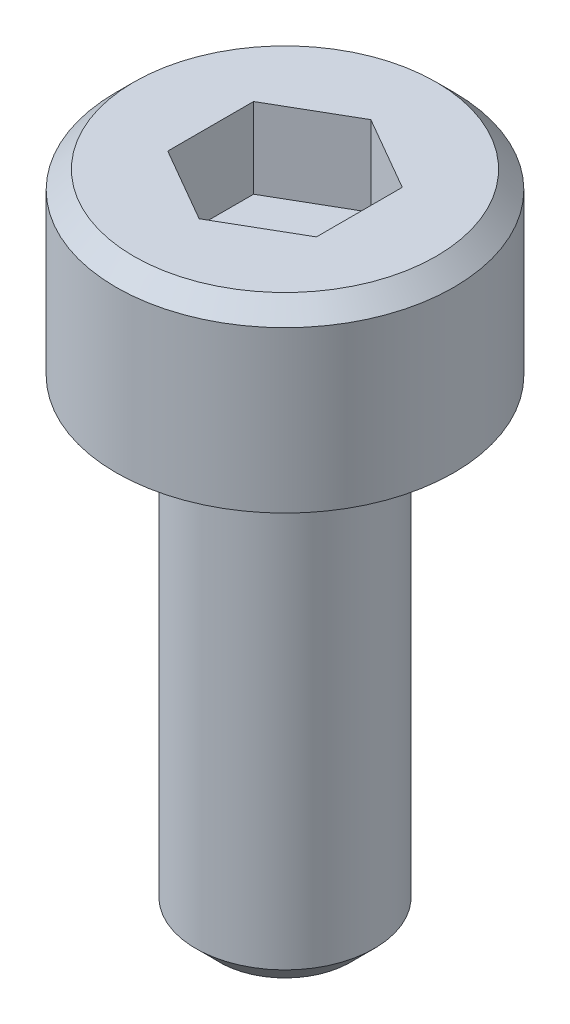
ISO-10303-21;
HEADER;
FILE_DESCRIPTION(('STEP AP214'),'2;1');
FILE_NAME('part.step','',(''),(''),'','','');
FILE_SCHEMA(('AUTOMOTIVE_DESIGN { 1 0 10303 214 1 1 1 1 }'));
ENDSEC;
DATA;
#1=APPLICATION_CONTEXT('core data for automotive mechanical design processes');
#2=APPLICATION_PROTOCOL_DEFINITION('international standard','automotive_design',2000,#1);
#3=PRODUCT_CONTEXT('',#1,'mechanical');
#4=PRODUCT('Part','Part','',(#3));
#5=PRODUCT_RELATED_PRODUCT_CATEGORY('part','',(#4));
#6=PRODUCT_DEFINITION_FORMATION('','',#4);
#7=PRODUCT_DEFINITION_CONTEXT('part definition',#1,'design');
#8=PRODUCT_DEFINITION('design','',#6,#7);
#9=PRODUCT_DEFINITION_SHAPE('','',#8);
#10=(LENGTH_UNIT() NAMED_UNIT(*) SI_UNIT(.MILLI.,.METRE.));
#11=(NAMED_UNIT(*) PLANE_ANGLE_UNIT() SI_UNIT($,.RADIAN.));
#12=(NAMED_UNIT(*) SI_UNIT($,.STERADIAN.) SOLID_ANGLE_UNIT());
#13=UNCERTAINTY_MEASURE_WITH_UNIT(LENGTH_MEASURE(1.E-05),#10,'distance_accuracy_value','');
#14=(GEOMETRIC_REPRESENTATION_CONTEXT(3) GLOBAL_UNCERTAINTY_ASSIGNED_CONTEXT((#13)) GLOBAL_UNIT_ASSIGNED_CONTEXT((#10,
#11,#12)) REPRESENTATION_CONTEXT('',''));
#15=CARTESIAN_POINT('',(0.,0.,0.));
#16=DIRECTION('',(0.,0.,1.));
#17=DIRECTION('',(1.,0.,0.));
#18=AXIS2_PLACEMENT_3D('',#15,#16,#17);
#19=CARTESIAN_POINT('',(0.,-8.,0.));
#20=DIRECTION('',(0.,-1.,0.));
#21=DIRECTION('',(0.,0.,-1.));
#22=AXIS2_PLACEMENT_3D('',#19,#20,#21);
#23=PLANE('',#22);
#24=CARTESIAN_POINT('',(0.,-8.,0.));
#25=DIRECTION('',(0.,-1.,0.));
#26=DIRECTION('',(0.,0.,-1.));
#27=AXIS2_PLACEMENT_3D('',#24,#25,#26);
#28=CIRCLE('',#27,1.1);
#29=CARTESIAN_POINT('',(0.,-8.,-1.1));
#30=VERTEX_POINT('',#29);
#31=EDGE_CURVE('E11',#30,#30,#28,.T.);
#32=ORIENTED_EDGE('',*,*,#31,.T.);
#33=EDGE_LOOP('',(#32));
#34=FACE_BOUND('',#33,.T.);
#35=ADVANCED_FACE('F41',(#34),#23,.T.);
#36=CARTESIAN_POINT('',(0.,-8.,0.));
#37=DIRECTION('',(0.,1.,0.));
#38=DIRECTION('',(0.,0.,1.));
#39=AXIS2_PLACEMENT_3D('',#36,#37,#38);
#40=CONICAL_SURFACE('',#39,1.1,0.785398163397448);
#41=CARTESIAN_POINT('',(0.,-7.6,0.));
#42=DIRECTION('',(0.,-1.,0.));
#43=DIRECTION('',(0.,0.,-1.));
#44=AXIS2_PLACEMENT_3D('',#41,#42,#43);
#45=CIRCLE('',#44,1.5);
#46=CARTESIAN_POINT('',(0.,-7.6,-1.5));
#47=VERTEX_POINT('',#46);
#48=EDGE_CURVE('E48',#47,#47,#45,.T.);
#49=ORIENTED_EDGE('',*,*,#48,.T.);
#50=EDGE_LOOP('',(#49));
#51=FACE_BOUND('',#50,.T.);
#52=ORIENTED_EDGE('',*,*,#31,.F.);
#53=EDGE_LOOP('',(#52));
#54=FACE_BOUND('',#53,.T.);
#55=ADVANCED_FACE('F161',(#51,#54),#40,.T.);
#56=CARTESIAN_POINT('',(0.,-10.,0.));
#57=DIRECTION('',(0.,-1.,0.));
#58=DIRECTION('',(0.,0.,-1.));
#59=AXIS2_PLACEMENT_3D('',#56,#57,#58);
#60=CYLINDRICAL_SURFACE('',#59,1.5);
#61=CARTESIAN_POINT('',(0.,0.,0.));
#62=DIRECTION('',(0.,-1.,0.));
#63=DIRECTION('',(0.,0.,-1.));
#64=AXIS2_PLACEMENT_3D('',#61,#62,#63);
#65=CIRCLE('',#64,1.5);
#66=CARTESIAN_POINT('',(0.,0.,-1.5));
#67=VERTEX_POINT('',#66);
#68=EDGE_CURVE('E156',#67,#67,#65,.T.);
#69=ORIENTED_EDGE('',*,*,#68,.T.);
#70=EDGE_LOOP('',(#69));
#71=FACE_BOUND('',#70,.T.);
#72=ORIENTED_EDGE('',*,*,#48,.F.);
#73=EDGE_LOOP('',(#72));
#74=FACE_BOUND('',#73,.T.);
#75=ADVANCED_FACE('F164',(#71,#74),#60,.T.);
#76=CARTESIAN_POINT('',(1.5,0.,0.));
#77=DIRECTION('',(0.,-1.,0.));
#78=DIRECTION('',(0.,0.,-1.));
#79=AXIS2_PLACEMENT_3D('',#76,#77,#78);
#80=PLANE('',#79);
#81=CARTESIAN_POINT('',(0.,0.,0.));
#82=DIRECTION('',(0.,-1.,0.));
#83=DIRECTION('',(0.,0.,-1.));
#84=AXIS2_PLACEMENT_3D('',#81,#82,#83);
#85=CIRCLE('',#84,2.84);
#86=CARTESIAN_POINT('',(0.,0.,-2.84));
#87=VERTEX_POINT('',#86);
#88=EDGE_CURVE('E153',#87,#87,#85,.T.);
#89=ORIENTED_EDGE('',*,*,#88,.T.);
#90=EDGE_LOOP('',(#89));
#91=FACE_BOUND('',#90,.T.);
#92=ORIENTED_EDGE('',*,*,#68,.F.);
#93=EDGE_LOOP('',(#92));
#94=FACE_BOUND('',#93,.T.);
#95=ADVANCED_FACE('F166',(#91,#94),#80,.T.);
#96=CARTESIAN_POINT('',(0.,-10.,0.));
#97=DIRECTION('',(0.,-1.,0.));
#98=DIRECTION('',(0.,0.,-1.));
#99=AXIS2_PLACEMENT_3D('',#96,#97,#98);
#100=CYLINDRICAL_SURFACE('',#99,2.84);
#101=CARTESIAN_POINT('',(0.,2.7,0.));
#102=DIRECTION('',(0.,-1.,0.));
#103=DIRECTION('',(0.,0.,-1.));
#104=AXIS2_PLACEMENT_3D('',#101,#102,#103);
#105=CIRCLE('',#104,2.84);
#106=CARTESIAN_POINT('',(0.,2.7,-2.84));
#107=VERTEX_POINT('',#106);
#108=EDGE_CURVE('E150',#107,#107,#105,.T.);
#109=ORIENTED_EDGE('',*,*,#108,.T.);
#110=EDGE_LOOP('',(#109));
#111=FACE_BOUND('',#110,.T.);
#112=ORIENTED_EDGE('',*,*,#88,.F.);
#113=EDGE_LOOP('',(#112));
#114=FACE_BOUND('',#113,.T.);
#115=ADVANCED_FACE('F172',(#111,#114),#100,.T.);
#116=CARTESIAN_POINT('',(0.,2.7,0.));
#117=DIRECTION('',(0.,-1.,0.));
#118=DIRECTION('',(0.,0.,-1.));
#119=AXIS2_PLACEMENT_3D('',#116,#117,#118);
#120=CONICAL_SURFACE('',#119,2.84,0.785398163397445);
#121=CARTESIAN_POINT('',(0.,3.,0.));
#122=DIRECTION('',(0.,-1.,0.));
#123=DIRECTION('',(0.,0.,-1.));
#124=AXIS2_PLACEMENT_3D('',#121,#122,#123);
#125=CIRCLE('',#124,2.54);
#126=CARTESIAN_POINT('',(0.,3.,-2.54));
#127=VERTEX_POINT('',#126);
#128=EDGE_CURVE('E142',#127,#127,#125,.T.);
#129=ORIENTED_EDGE('',*,*,#128,.T.);
#130=EDGE_LOOP('',(#129));
#131=FACE_BOUND('',#130,.T.);
#132=ORIENTED_EDGE('',*,*,#108,.F.);
#133=EDGE_LOOP('',(#132));
#134=FACE_BOUND('',#133,.T.);
#135=ADVANCED_FACE('F207',(#131,#134),#120,.T.);
#136=CARTESIAN_POINT('',(2.54,3.,0.));
#137=DIRECTION('',(0.,1.,0.));
#138=DIRECTION('',(0.,0.,1.));
#139=AXIS2_PLACEMENT_3D('',#136,#137,#138);
#140=PLANE('',#139);
#141=DIRECTION('',(0.,0.,-1.));
#142=VECTOR('',#141,1.);
#143=CARTESIAN_POINT('',(1.25,3.,-0.721687836487032));
#144=LINE('',#143,#142);
#145=CARTESIAN_POINT('',(1.25,3.,0.721687836487032));
#146=VERTEX_POINT('',#145);
#147=CARTESIAN_POINT('',(1.25,3.,-0.721687836487032));
#148=VERTEX_POINT('',#147);
#149=EDGE_CURVE('E55',#146,#148,#144,.T.);
#150=ORIENTED_EDGE('',*,*,#149,.F.);
#151=DIRECTION('',(0.866025403784439,0.,-0.5));
#152=VECTOR('',#151,1.);
#153=CARTESIAN_POINT('',(1.25,3.,0.721687836487032));
#154=LINE('',#153,#152);
#155=CARTESIAN_POINT('',(0.,3.,1.44337567297406));
#156=VERTEX_POINT('',#155);
#157=EDGE_CURVE('E138',#156,#146,#154,.T.);
#158=ORIENTED_EDGE('',*,*,#157,.F.);
#159=DIRECTION('',(0.866025403784439,0.,0.5));
#160=VECTOR('',#159,1.);
#161=CARTESIAN_POINT('',(0.,3.,1.44337567297406));
#162=LINE('',#161,#160);
#163=CARTESIAN_POINT('',(-1.25,3.,0.721687836487033));
#164=VERTEX_POINT('',#163);
#165=EDGE_CURVE('E136',#164,#156,#162,.T.);
#166=ORIENTED_EDGE('',*,*,#165,.F.);
#167=DIRECTION('',(0.,0.,1.));
#168=VECTOR('',#167,1.);
#169=CARTESIAN_POINT('',(-1.25,3.,0.721687836487033));
#170=LINE('',#169,#168);
#171=CARTESIAN_POINT('',(-1.25,3.,-0.721687836487032));
#172=VERTEX_POINT('',#171);
#173=EDGE_CURVE('E103',#172,#164,#170,.T.);
#174=ORIENTED_EDGE('',*,*,#173,.F.);
#175=DIRECTION('',(-0.866025403784438,0.,0.5));
#176=VECTOR('',#175,1.);
#177=CARTESIAN_POINT('',(-1.25,3.,-0.721687836487032));
#178=LINE('',#177,#176);
#179=CARTESIAN_POINT('',(0.,3.,-1.44337567297406));
#180=VERTEX_POINT('',#179);
#181=EDGE_CURVE('E132',#180,#172,#178,.T.);
#182=ORIENTED_EDGE('',*,*,#181,.F.);
#183=DIRECTION('',(-0.866025403784439,0.,-0.5));
#184=VECTOR('',#183,1.);
#185=CARTESIAN_POINT('',(0.,3.,-1.44337567297406));
#186=LINE('',#185,#184);
#187=EDGE_CURVE('E129',#148,#180,#186,.T.);
#188=ORIENTED_EDGE('',*,*,#187,.F.);
#189=EDGE_LOOP('',(#150,#158,#166,#174,#182,#188));
#190=FACE_BOUND('',#189,.T.);
#191=ORIENTED_EDGE('',*,*,#128,.F.);
#192=EDGE_LOOP('',(#191));
#193=FACE_BOUND('',#192,.T.);
#194=ADVANCED_FACE('F216',(#190,#193),#140,.T.);
#195=CARTESIAN_POINT('',(1.25,1.65,-0.721687836487032));
#196=DIRECTION('',(1.,0.,0.));
#197=DIRECTION('',(0.,0.,-1.));
#198=AXIS2_PLACEMENT_3D('',#195,#196,#197);
#199=PLANE('',#198);
#200=ORIENTED_EDGE('',*,*,#149,.T.);
#201=DIRECTION('',(0.,1.,0.));
#202=VECTOR('',#201,1.);
#203=CARTESIAN_POINT('',(1.25,1.65,-0.721687836487032));
#204=LINE('',#203,#202);
#205=CARTESIAN_POINT('',(1.25,1.65,-0.721687836487032));
#206=VERTEX_POINT('',#205);
#207=EDGE_CURVE('E85',#206,#148,#204,.T.);
#208=ORIENTED_EDGE('',*,*,#207,.F.);
#209=DIRECTION('',(0.,0.,-1.));
#210=VECTOR('',#209,1.);
#211=CARTESIAN_POINT('',(1.25,1.65,-0.721687836487032));
#212=LINE('',#211,#210);
#213=CARTESIAN_POINT('',(1.25,1.65,0.721687836487032));
#214=VERTEX_POINT('',#213);
#215=EDGE_CURVE('E140',#214,#206,#212,.T.);
#216=ORIENTED_EDGE('',*,*,#215,.F.);
#217=DIRECTION('',(0.,1.,0.));
#218=VECTOR('',#217,1.);
#219=CARTESIAN_POINT('',(1.25,1.65,0.721687836487032));
#220=LINE('',#219,#218);
#221=EDGE_CURVE('E63',#214,#146,#220,.T.);
#222=ORIENTED_EDGE('',*,*,#221,.T.);
#223=EDGE_LOOP('',(#200,#208,#216,#222));
#224=FACE_BOUND('',#223,.T.);
#225=ADVANCED_FACE('F225',(#224),#199,.F.);
#226=CARTESIAN_POINT('',(1.25,1.65,0.721687836487032));
#227=DIRECTION('',(0.5,0.,0.866025403784439));
#228=DIRECTION('',(0.866025403784439,0.,-0.5));
#229=AXIS2_PLACEMENT_3D('',#226,#227,#228);
#230=PLANE('',#229);
#231=ORIENTED_EDGE('',*,*,#157,.T.);
#232=ORIENTED_EDGE('',*,*,#221,.F.);
#233=DIRECTION('',(0.866025403784439,0.,-0.5));
#234=VECTOR('',#233,1.);
#235=CARTESIAN_POINT('',(1.25,1.65,0.721687836487032));
#236=LINE('',#235,#234);
#237=CARTESIAN_POINT('',(0.,1.65,1.44337567297406));
#238=VERTEX_POINT('',#237);
#239=EDGE_CURVE('E115',#238,#214,#236,.T.);
#240=ORIENTED_EDGE('',*,*,#239,.F.);
#241=DIRECTION('',(0.,1.,0.));
#242=VECTOR('',#241,1.);
#243=CARTESIAN_POINT('',(0.,1.65,1.44337567297406));
#244=LINE('',#243,#242);
#245=EDGE_CURVE('E107',#238,#156,#244,.T.);
#246=ORIENTED_EDGE('',*,*,#245,.T.);
#247=EDGE_LOOP('',(#231,#232,#240,#246));
#248=FACE_BOUND('',#247,.T.);
#249=ADVANCED_FACE('F234',(#248),#230,.F.);
#250=CARTESIAN_POINT('',(0.,1.65,1.44337567297406));
#251=DIRECTION('',(-0.5,0.,0.866025403784439));
#252=DIRECTION('',(0.866025403784439,0.,0.5));
#253=AXIS2_PLACEMENT_3D('',#250,#251,#252);
#254=PLANE('',#253);
#255=ORIENTED_EDGE('',*,*,#165,.T.);
#256=ORIENTED_EDGE('',*,*,#245,.F.);
#257=DIRECTION('',(0.866025403784439,0.,0.5));
#258=VECTOR('',#257,1.);
#259=CARTESIAN_POINT('',(0.,1.65,1.44337567297406));
#260=LINE('',#259,#258);
#261=CARTESIAN_POINT('',(-1.25,1.65,0.721687836487033));
#262=VERTEX_POINT('',#261);
#263=EDGE_CURVE('E111',#262,#238,#260,.T.);
#264=ORIENTED_EDGE('',*,*,#263,.F.);
#265=DIRECTION('',(0.,1.,0.));
#266=VECTOR('',#265,1.);
#267=CARTESIAN_POINT('',(-1.25,1.65,0.721687836487033));
#268=LINE('',#267,#266);
#269=EDGE_CURVE('E96',#262,#164,#268,.T.);
#270=ORIENTED_EDGE('',*,*,#269,.T.);
#271=EDGE_LOOP('',(#255,#256,#264,#270));
#272=FACE_BOUND('',#271,.T.);
#273=ADVANCED_FACE('F112',(#272),#254,.F.);
#274=CARTESIAN_POINT('',(-1.25,1.65,0.721687836487033));
#275=DIRECTION('',(-1.,0.,0.));
#276=DIRECTION('',(0.,0.,1.));
#277=AXIS2_PLACEMENT_3D('',#274,#275,#276);
#278=PLANE('',#277);
#279=ORIENTED_EDGE('',*,*,#173,.T.);
#280=ORIENTED_EDGE('',*,*,#269,.F.);
#281=DIRECTION('',(0.,0.,1.));
#282=VECTOR('',#281,1.);
#283=CARTESIAN_POINT('',(-1.25,1.65,0.721687836487033));
#284=LINE('',#283,#282);
#285=CARTESIAN_POINT('',(-1.25,1.65,-0.721687836487032));
#286=VERTEX_POINT('',#285);
#287=EDGE_CURVE('E100',#286,#262,#284,.T.);
#288=ORIENTED_EDGE('',*,*,#287,.F.);
#289=DIRECTION('',(0.,1.,0.));
#290=VECTOR('',#289,1.);
#291=CARTESIAN_POINT('',(-1.25,1.65,-0.721687836487032));
#292=LINE('',#291,#290);
#293=EDGE_CURVE('E108',#286,#172,#292,.T.);
#294=ORIENTED_EDGE('',*,*,#293,.T.);
#295=EDGE_LOOP('',(#279,#280,#288,#294));
#296=FACE_BOUND('',#295,.T.);
#297=ADVANCED_FACE('F98',(#296),#278,.F.);
#298=CARTESIAN_POINT('',(-1.25,1.65,-0.721687836487032));
#299=DIRECTION('',(-0.5,0.,-0.866025403784438));
#300=DIRECTION('',(-0.866025403784439,0.,0.5));
#301=AXIS2_PLACEMENT_3D('',#298,#299,#300);
#302=PLANE('',#301);
#303=ORIENTED_EDGE('',*,*,#181,.T.);
#304=ORIENTED_EDGE('',*,*,#293,.F.);
#305=DIRECTION('',(-0.866025403784438,0.,0.5));
#306=VECTOR('',#305,1.);
#307=CARTESIAN_POINT('',(-1.25,1.65,-0.721687836487032));
#308=LINE('',#307,#306);
#309=CARTESIAN_POINT('',(0.,1.65,-1.44337567297406));
#310=VERTEX_POINT('',#309);
#311=EDGE_CURVE('E121',#310,#286,#308,.T.);
#312=ORIENTED_EDGE('',*,*,#311,.F.);
#313=DIRECTION('',(0.,1.,0.));
#314=VECTOR('',#313,1.);
#315=CARTESIAN_POINT('',(0.,1.65,-1.44337567297406));
#316=LINE('',#315,#314);
#317=EDGE_CURVE('E145',#310,#180,#316,.T.);
#318=ORIENTED_EDGE('',*,*,#317,.T.);
#319=EDGE_LOOP('',(#303,#304,#312,#318));
#320=FACE_BOUND('',#319,.T.);
#321=ADVANCED_FACE('F256',(#320),#302,.F.);
#322=CARTESIAN_POINT('',(0.,1.65,-1.44337567297406));
#323=DIRECTION('',(0.5,0.,-0.866025403784439));
#324=DIRECTION('',(-0.866025403784439,0.,-0.5));
#325=AXIS2_PLACEMENT_3D('',#322,#323,#324);
#326=PLANE('',#325);
#327=ORIENTED_EDGE('',*,*,#187,.T.);
#328=ORIENTED_EDGE('',*,*,#317,.F.);
#329=DIRECTION('',(-0.866025403784439,0.,-0.5));
#330=VECTOR('',#329,1.);
#331=CARTESIAN_POINT('',(0.,1.65,-1.44337567297406));
#332=LINE('',#331,#330);
#333=EDGE_CURVE('E123',#206,#310,#332,.T.);
#334=ORIENTED_EDGE('',*,*,#333,.F.);
#335=ORIENTED_EDGE('',*,*,#207,.T.);
#336=EDGE_LOOP('',(#327,#328,#334,#335));
#337=FACE_BOUND('',#336,.T.);
#338=ADVANCED_FACE('F264',(#337),#326,.F.);
#339=CARTESIAN_POINT('',(0.,1.65,0.));
#340=DIRECTION('',(0.,-1.,0.));
#341=DIRECTION('',(0.,0.,-1.));
#342=AXIS2_PLACEMENT_3D('',#339,#340,#341);
#343=PLANE('',#342);
#344=ORIENTED_EDGE('',*,*,#215,.T.);
#345=ORIENTED_EDGE('',*,*,#333,.T.);
#346=ORIENTED_EDGE('',*,*,#311,.T.);
#347=ORIENTED_EDGE('',*,*,#287,.T.);
#348=ORIENTED_EDGE('',*,*,#263,.T.);
#349=ORIENTED_EDGE('',*,*,#239,.T.);
#350=EDGE_LOOP('',(#344,#345,#346,#347,#348,#349));
#351=FACE_BOUND('',#350,.T.);
#352=ADVANCED_FACE('F118',(#351),#343,.F.);
#353=CLOSED_SHELL('',(#35,#55,#75,#95,#115,#135,#194,#225,#249,#273,#297,#321,#338,#352));
#354=MANIFOLD_SOLID_BREP('B2',#353);
#355=ADVANCED_BREP_SHAPE_REPRESENTATION('',(#18,#354),#14);
#356=SHAPE_DEFINITION_REPRESENTATION(#9,#355);
ENDSEC;
END-ISO-10303-21;
